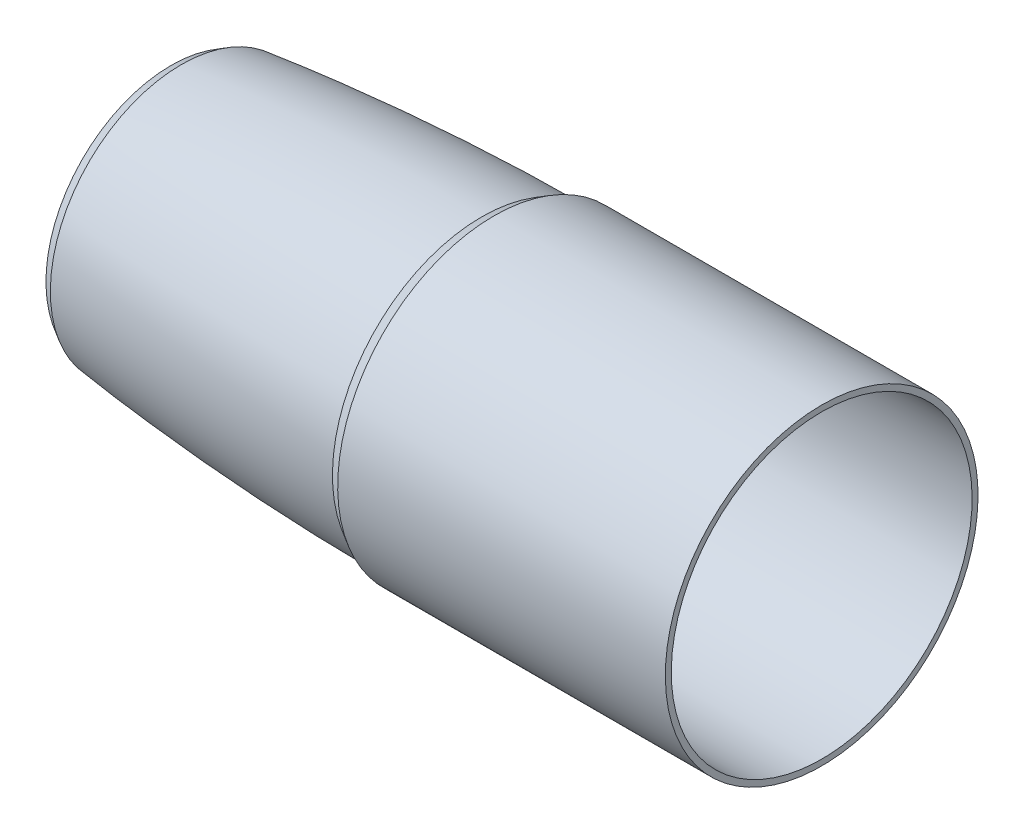
ISO-10303-21;
HEADER;
FILE_DESCRIPTION(('STEP AP214'),'2;1');
FILE_NAME('part.step','',(''),(''),'','','');
FILE_SCHEMA(('AUTOMOTIVE_DESIGN { 1 0 10303 214 1 1 1 1 }'));
ENDSEC;
DATA;
#1=APPLICATION_CONTEXT('core data for automotive mechanical design processes');
#2=APPLICATION_PROTOCOL_DEFINITION('international standard','automotive_design',2000,#1);
#3=PRODUCT_CONTEXT('',#1,'mechanical');
#4=PRODUCT('Part','Part','',(#3));
#5=PRODUCT_RELATED_PRODUCT_CATEGORY('part','',(#4));
#6=PRODUCT_DEFINITION_FORMATION('','',#4);
#7=PRODUCT_DEFINITION_CONTEXT('part definition',#1,'design');
#8=PRODUCT_DEFINITION('design','',#6,#7);
#9=PRODUCT_DEFINITION_SHAPE('','',#8);
#10=(LENGTH_UNIT() NAMED_UNIT(*) SI_UNIT(.MILLI.,.METRE.));
#11=(NAMED_UNIT(*) PLANE_ANGLE_UNIT() SI_UNIT($,.RADIAN.));
#12=(NAMED_UNIT(*) SI_UNIT($,.STERADIAN.) SOLID_ANGLE_UNIT());
#13=UNCERTAINTY_MEASURE_WITH_UNIT(LENGTH_MEASURE(1.E-05),#10,'distance_accuracy_value','');
#14=(GEOMETRIC_REPRESENTATION_CONTEXT(3) GLOBAL_UNCERTAINTY_ASSIGNED_CONTEXT((#13)) GLOBAL_UNIT_ASSIGNED_CONTEXT((#10,
#11,#12)) REPRESENTATION_CONTEXT('',''));
#15=CARTESIAN_POINT('',(0.,0.,0.));
#16=DIRECTION('',(0.,0.,1.));
#17=DIRECTION('',(1.,0.,0.));
#18=AXIS2_PLACEMENT_3D('',#15,#16,#17);
#19=CARTESIAN_POINT('',(0.,0.,0.));
#20=DIRECTION('',(1.,0.,0.));
#21=DIRECTION('',(0.,1.,0.));
#22=AXIS2_PLACEMENT_3D('',#19,#20,#21);
#23=DEGENERATE_TOROIDAL_SURFACE('',#22,642.33383838384,680.13383838384,.F.);
#24=CARTESIAN_POINT('',(-3.13016740513915,0.,0.));
#25=DIRECTION('',(1.,0.,0.));
#26=DIRECTION('',(0.,1.,0.));
#27=AXIS2_PLACEMENT_3D('',#24,#25,#26);
#28=CIRCLE('',#27,37.7927970060343);
#29=CARTESIAN_POINT('',(-3.13016740513916,37.7927970060343,0.));
#30=VERTEX_POINT('',#29);
#31=EDGE_CURVE('E65',#30,#30,#28,.T.);
#32=ORIENTED_EDGE('',*,*,#31,.F.);
#33=EDGE_LOOP('',(#32));
#34=FACE_BOUND('',#33,.T.);
#35=CARTESIAN_POINT('',(-79.2,0.,0.));
#36=DIRECTION('',(1.,0.,0.));
#37=DIRECTION('',(0.,1.,0.));
#38=AXIS2_PLACEMENT_3D('',#35,#36,#37);
#39=CIRCLE('',#38,33.1729329476806);
#40=CARTESIAN_POINT('',(-79.2,33.1729329476806,0.));
#41=VERTEX_POINT('',#40);
#42=EDGE_CURVE('E10',#41,#41,#39,.T.);
#43=ORIENTED_EDGE('',*,*,#42,.T.);
#44=EDGE_LOOP('',(#43));
#45=FACE_BOUND('',#44,.T.);
#46=ADVANCED_FACE('F37',(#34,#45),#23,.F.);
#47=CARTESIAN_POINT('',(-79.2,0.,0.));
#48=DIRECTION('',(1.,0.,0.));
#49=DIRECTION('',(0.,1.,0.));
#50=AXIS2_PLACEMENT_3D('',#47,#48,#49);
#51=CONICAL_SURFACE('',#50,33.1729329476806,0.52359877559832);
#52=CARTESIAN_POINT('',(-81.8385824334385,0.,0.));
#53=DIRECTION('',(1.,0.,0.));
#54=DIRECTION('',(0.,1.,0.));
#55=AXIS2_PLACEMENT_3D('',#52,#53,#54);
#56=CIRCLE('',#55,31.6495466694559);
#57=CARTESIAN_POINT('',(-81.8385824334385,31.6495466694559,0.));
#58=VERTEX_POINT('',#57);
#59=EDGE_CURVE('E43',#58,#58,#56,.T.);
#60=ORIENTED_EDGE('',*,*,#59,.T.);
#61=EDGE_LOOP('',(#60));
#62=FACE_BOUND('',#61,.T.);
#63=ORIENTED_EDGE('',*,*,#42,.F.);
#64=EDGE_LOOP('',(#63));
#65=FACE_BOUND('',#64,.T.);
#66=ADVANCED_FACE('F73',(#62,#65),#51,.T.);
#67=CARTESIAN_POINT('',(0.,0.,0.));
#68=DIRECTION('',(1.,0.,0.));
#69=DIRECTION('',(0.,1.,0.));
#70=AXIS2_PLACEMENT_3D('',#67,#68,#69);
#71=DEGENERATE_TOROIDAL_SURFACE('',#70,642.33383838384,678.93383838384,.F.);
#72=CARTESIAN_POINT('',(0.,0.,0.));
#73=DIRECTION('',(1.,0.,0.));
#74=DIRECTION('',(0.,1.,0.));
#75=AXIS2_PLACEMENT_3D('',#72,#73,#74);
#76=CIRCLE('',#75,36.6);
#77=CARTESIAN_POINT('',(0.,36.6,0.));
#78=VERTEX_POINT('',#77);
#79=EDGE_CURVE('E47',#78,#78,#76,.T.);
#80=ORIENTED_EDGE('',*,*,#79,.T.);
#81=EDGE_LOOP('',(#80));
#82=FACE_BOUND('',#81,.T.);
#83=ORIENTED_EDGE('',*,*,#59,.F.);
#84=EDGE_LOOP('',(#83));
#85=FACE_BOUND('',#84,.T.);
#86=ADVANCED_FACE('F77',(#82,#85),#71,.T.);
#87=CARTESIAN_POINT('',(0.,0.,0.));
#88=DIRECTION('',(1.,0.,0.));
#89=DIRECTION('',(0.,1.,0.));
#90=AXIS2_PLACEMENT_3D('',#87,#88,#89);
#91=CONICAL_SURFACE('',#90,36.6,0.523598775598296);
#92=CARTESIAN_POINT('',(2.59807621135346,0.,0.));
#93=DIRECTION('',(1.,0.,0.));
#94=DIRECTION('',(0.,1.,0.));
#95=AXIS2_PLACEMENT_3D('',#92,#93,#94);
#96=CIRCLE('',#95,38.1);
#97=CARTESIAN_POINT('',(2.59807621135346,38.1,0.));
#98=VERTEX_POINT('',#97);
#99=EDGE_CURVE('E51',#98,#98,#96,.T.);
#100=ORIENTED_EDGE('',*,*,#99,.T.);
#101=EDGE_LOOP('',(#100));
#102=FACE_BOUND('',#101,.T.);
#103=ORIENTED_EDGE('',*,*,#79,.F.);
#104=EDGE_LOOP('',(#103));
#105=FACE_BOUND('',#104,.T.);
#106=ADVANCED_FACE('F81',(#102,#105),#91,.F.);
#107=CARTESIAN_POINT('',(0.,0.,0.));
#108=DIRECTION('',(1.,0.,0.));
#109=DIRECTION('',(0.,1.,0.));
#110=AXIS2_PLACEMENT_3D('',#107,#108,#109);
#111=CYLINDRICAL_SURFACE('',#110,38.1);
#112=ORIENTED_EDGE('',*,*,#99,.F.);
#113=EDGE_LOOP('',(#112));
#114=FACE_BOUND('',#113,.T.);
#115=CARTESIAN_POINT('',(83.,0.,0.));
#116=DIRECTION('',(1.,0.,0.));
#117=DIRECTION('',(0.,1.,0.));
#118=AXIS2_PLACEMENT_3D('',#115,#116,#117);
#119=CIRCLE('',#118,38.1);
#120=CARTESIAN_POINT('',(83.,38.1,0.));
#121=VERTEX_POINT('',#120);
#122=EDGE_CURVE('E56',#121,#121,#119,.T.);
#123=ORIENTED_EDGE('',*,*,#122,.T.);
#124=EDGE_LOOP('',(#123));
#125=FACE_BOUND('',#124,.T.);
#126=ADVANCED_FACE('F88',(#114,#125),#111,.F.);
#127=CARTESIAN_POINT('',(83.,0.,0.));
#128=DIRECTION('',(1.,0.,0.));
#129=DIRECTION('',(0.,1.,0.));
#130=AXIS2_PLACEMENT_3D('',#127,#128,#129);
#131=PLANE('',#130);
#132=CARTESIAN_POINT('',(83.,0.,0.));
#133=DIRECTION('',(1.,0.,0.));
#134=DIRECTION('',(0.,1.,0.));
#135=AXIS2_PLACEMENT_3D('',#132,#133,#134);
#136=CIRCLE('',#135,39.6);
#137=CARTESIAN_POINT('',(83.,39.6,0.));
#138=VERTEX_POINT('',#137);
#139=EDGE_CURVE('E59',#138,#138,#136,.T.);
#140=ORIENTED_EDGE('',*,*,#139,.T.);
#141=EDGE_LOOP('',(#140));
#142=FACE_BOUND('',#141,.T.);
#143=ORIENTED_EDGE('',*,*,#122,.F.);
#144=EDGE_LOOP('',(#143));
#145=FACE_BOUND('',#144,.T.);
#146=ADVANCED_FACE('F92',(#142,#145),#131,.T.);
#147=CARTESIAN_POINT('',(0.,0.,0.));
#148=DIRECTION('',(1.,0.,0.));
#149=DIRECTION('',(0.,1.,0.));
#150=AXIS2_PLACEMENT_3D('',#147,#148,#149);
#151=CYLINDRICAL_SURFACE('',#150,39.6);
#152=ORIENTED_EDGE('',*,*,#139,.F.);
#153=EDGE_LOOP('',(#152));
#154=FACE_BOUND('',#153,.T.);
#155=CARTESIAN_POINT('',(0.,0.,0.));
#156=DIRECTION('',(1.,0.,0.));
#157=DIRECTION('',(0.,1.,0.));
#158=AXIS2_PLACEMENT_3D('',#155,#156,#157);
#159=CIRCLE('',#158,39.6);
#160=CARTESIAN_POINT('',(0.,39.6,0.));
#161=VERTEX_POINT('',#160);
#162=EDGE_CURVE('E62',#161,#161,#159,.T.);
#163=ORIENTED_EDGE('',*,*,#162,.T.);
#164=EDGE_LOOP('',(#163));
#165=FACE_BOUND('',#164,.T.);
#166=ADVANCED_FACE('F96',(#154,#165),#151,.T.);
#167=CARTESIAN_POINT('',(0.,0.,0.));
#168=DIRECTION('',(1.,0.,0.));
#169=DIRECTION('',(0.,1.,0.));
#170=AXIS2_PLACEMENT_3D('',#167,#168,#169);
#171=CONICAL_SURFACE('',#170,39.6,0.523598775598301);
#172=ORIENTED_EDGE('',*,*,#31,.T.);
#173=EDGE_LOOP('',(#172));
#174=FACE_BOUND('',#173,.T.);
#175=ORIENTED_EDGE('',*,*,#162,.F.);
#176=EDGE_LOOP('',(#175));
#177=FACE_BOUND('',#176,.T.);
#178=ADVANCED_FACE('F69',(#174,#177),#171,.T.);
#179=CLOSED_SHELL('',(#46,#66,#86,#106,#126,#146,#166,#178));
#180=MANIFOLD_SOLID_BREP('B2',#179);
#181=ADVANCED_BREP_SHAPE_REPRESENTATION('',(#18,#180),#14);
#182=SHAPE_DEFINITION_REPRESENTATION(#9,#181);
ENDSEC;
END-ISO-10303-21;
